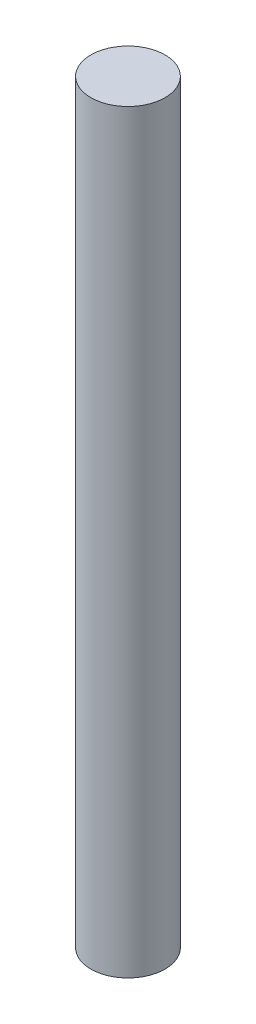
ISO-10303-21;
HEADER;
FILE_DESCRIPTION(('STEP AP214'),'2;1');
FILE_NAME('part.step','',(''),(''),'','','');
FILE_SCHEMA(('AUTOMOTIVE_DESIGN { 1 0 10303 214 1 1 1 1 }'));
ENDSEC;
DATA;
#1=APPLICATION_CONTEXT('core data for automotive mechanical design processes');
#2=APPLICATION_PROTOCOL_DEFINITION('international standard','automotive_design',2000,#1);
#3=PRODUCT_CONTEXT('',#1,'mechanical');
#4=PRODUCT('Part','Part','',(#3));
#5=PRODUCT_RELATED_PRODUCT_CATEGORY('part','',(#4));
#6=PRODUCT_DEFINITION_FORMATION('','',#4);
#7=PRODUCT_DEFINITION_CONTEXT('part definition',#1,'design');
#8=PRODUCT_DEFINITION('design','',#6,#7);
#9=PRODUCT_DEFINITION_SHAPE('','',#8);
#10=(LENGTH_UNIT() NAMED_UNIT(*) SI_UNIT(.MILLI.,.METRE.));
#11=(NAMED_UNIT(*) PLANE_ANGLE_UNIT() SI_UNIT($,.RADIAN.));
#12=(NAMED_UNIT(*) SI_UNIT($,.STERADIAN.) SOLID_ANGLE_UNIT());
#13=UNCERTAINTY_MEASURE_WITH_UNIT(LENGTH_MEASURE(1.E-05),#10,'distance_accuracy_value','');
#14=(GEOMETRIC_REPRESENTATION_CONTEXT(3) GLOBAL_UNCERTAINTY_ASSIGNED_CONTEXT((#13)) GLOBAL_UNIT_ASSIGNED_CONTEXT((#10,
#11,#12)) REPRESENTATION_CONTEXT('',''));
#15=CARTESIAN_POINT('',(0.,0.,0.));
#16=DIRECTION('',(0.,0.,1.));
#17=DIRECTION('',(1.,0.,0.));
#18=AXIS2_PLACEMENT_3D('',#15,#16,#17);
#19=CARTESIAN_POINT('',(0.,570.,0.));
#20=DIRECTION('',(0.,-1.,0.));
#21=DIRECTION('',(0.,0.,-1.));
#22=AXIS2_PLACEMENT_3D('',#19,#20,#21);
#23=CYLINDRICAL_SURFACE('',#22,26.);
#24=CARTESIAN_POINT('',(0.,0.,0.));
#25=DIRECTION('',(0.,1.,0.));
#26=DIRECTION('',(0.,0.,1.));
#27=AXIS2_PLACEMENT_3D('',#24,#25,#26);
#28=CIRCLE('',#27,26.);
#29=CARTESIAN_POINT('',(0.,0.,26.));
#30=VERTEX_POINT('',#29);
#31=EDGE_CURVE('E48',#30,#30,#28,.T.);
#32=ORIENTED_EDGE('',*,*,#31,.F.);
#33=EDGE_LOOP('',(#32));
#34=FACE_BOUND('',#33,.T.);
#35=CARTESIAN_POINT('',(0.,568.,0.));
#36=DIRECTION('',(0.,1.,0.));
#37=DIRECTION('',(0.,0.,1.));
#38=AXIS2_PLACEMENT_3D('',#35,#36,#37);
#39=CIRCLE('',#38,26.);
#40=CARTESIAN_POINT('',(0.,568.,26.));
#41=VERTEX_POINT('',#40);
#42=EDGE_CURVE('E52',#41,#41,#39,.T.);
#43=ORIENTED_EDGE('',*,*,#42,.T.);
#44=EDGE_LOOP('',(#43));
#45=FACE_BOUND('',#44,.T.);
#46=ADVANCED_FACE('F37',(#34,#45),#23,.F.);
#47=CARTESIAN_POINT('',(0.,570.,0.));
#48=DIRECTION('',(0.,1.,0.));
#49=DIRECTION('',(0.,0.,1.));
#50=AXIS2_PLACEMENT_3D('',#47,#48,#49);
#51=PLANE('',#50);
#52=CARTESIAN_POINT('',(0.,570.,0.));
#53=DIRECTION('',(0.,1.,0.));
#54=DIRECTION('',(0.,0.,1.));
#55=AXIS2_PLACEMENT_3D('',#52,#53,#54);
#56=CIRCLE('',#55,28.);
#57=CARTESIAN_POINT('',(0.,570.,28.));
#58=VERTEX_POINT('',#57);
#59=EDGE_CURVE('E10',#58,#58,#56,.T.);
#60=ORIENTED_EDGE('',*,*,#59,.T.);
#61=EDGE_LOOP('',(#60));
#62=FACE_BOUND('',#61,.T.);
#63=ADVANCED_FACE('F68',(#62),#51,.T.);
#64=CARTESIAN_POINT('',(0.,0.,0.));
#65=DIRECTION('',(0.,1.,0.));
#66=DIRECTION('',(0.,0.,1.));
#67=AXIS2_PLACEMENT_3D('',#64,#65,#66);
#68=PLANE('',#67);
#69=CARTESIAN_POINT('',(0.,0.,0.));
#70=DIRECTION('',(0.,1.,0.));
#71=DIRECTION('',(0.,0.,1.));
#72=AXIS2_PLACEMENT_3D('',#69,#70,#71);
#73=CIRCLE('',#72,28.);
#74=CARTESIAN_POINT('',(0.,0.,28.));
#75=VERTEX_POINT('',#74);
#76=EDGE_CURVE('E41',#75,#75,#73,.T.);
#77=ORIENTED_EDGE('',*,*,#76,.F.);
#78=EDGE_LOOP('',(#77));
#79=FACE_BOUND('',#78,.T.);
#80=ORIENTED_EDGE('',*,*,#31,.T.);
#81=EDGE_LOOP('',(#80));
#82=FACE_BOUND('',#81,.T.);
#83=ADVANCED_FACE('F64',(#79,#82),#68,.F.);
#84=CARTESIAN_POINT('',(0.,570.,0.));
#85=DIRECTION('',(0.,-1.,0.));
#86=DIRECTION('',(0.,0.,-1.));
#87=AXIS2_PLACEMENT_3D('',#84,#85,#86);
#88=CYLINDRICAL_SURFACE('',#87,28.);
#89=ORIENTED_EDGE('',*,*,#59,.F.);
#90=EDGE_LOOP('',(#89));
#91=FACE_BOUND('',#90,.T.);
#92=ORIENTED_EDGE('',*,*,#76,.T.);
#93=EDGE_LOOP('',(#92));
#94=FACE_BOUND('',#93,.T.);
#95=ADVANCED_FACE('F39',(#91,#94),#88,.T.);
#96=CARTESIAN_POINT('',(0.,568.,0.));
#97=DIRECTION('',(0.,1.,0.));
#98=DIRECTION('',(0.,0.,1.));
#99=AXIS2_PLACEMENT_3D('',#96,#97,#98);
#100=PLANE('',#99);
#101=ORIENTED_EDGE('',*,*,#42,.F.);
#102=EDGE_LOOP('',(#101));
#103=FACE_BOUND('',#102,.T.);
#104=ADVANCED_FACE('F57',(#103),#100,.F.);
#105=CLOSED_SHELL('',(#46,#63,#83,#95,#104));
#106=MANIFOLD_SOLID_BREP('B2',#105);
#107=ADVANCED_BREP_SHAPE_REPRESENTATION('',(#18,#106),#14);
#108=SHAPE_DEFINITION_REPRESENTATION(#9,#107);
ENDSEC;
END-ISO-10303-21;
